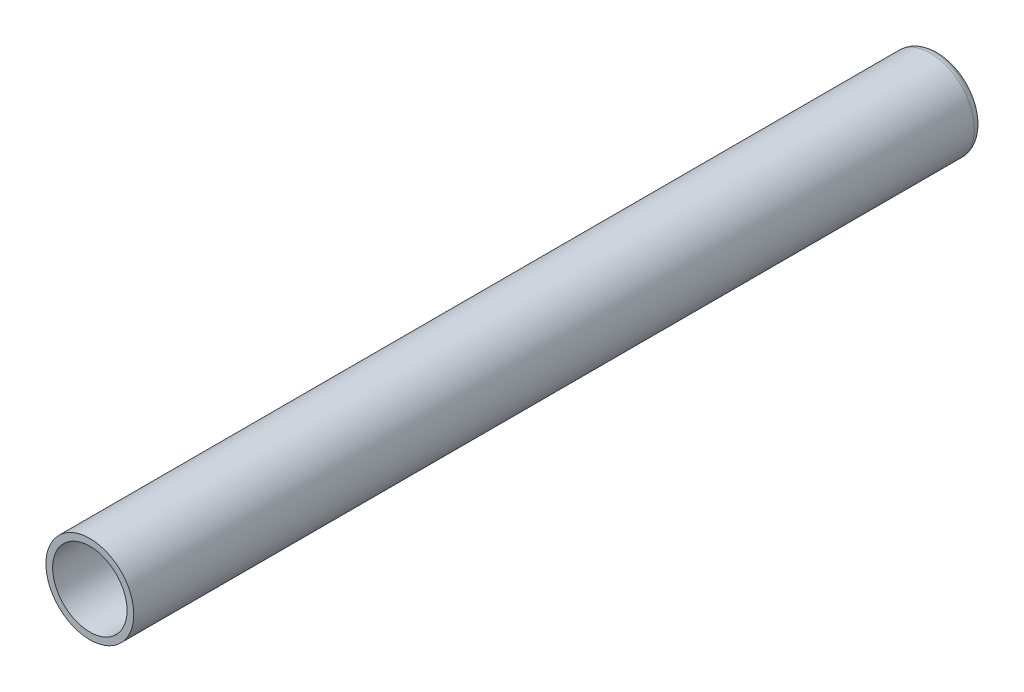
ISO-10303-21;
HEADER;
FILE_DESCRIPTION(('STEP AP214'),'2;1');
FILE_NAME('part.step','',(''),(''),'','','');
FILE_SCHEMA(('AUTOMOTIVE_DESIGN { 1 0 10303 214 1 1 1 1 }'));
ENDSEC;
DATA;
#1=APPLICATION_CONTEXT('core data for automotive mechanical design processes');
#2=APPLICATION_PROTOCOL_DEFINITION('international standard','automotive_design',2000,#1);
#3=PRODUCT_CONTEXT('',#1,'mechanical');
#4=PRODUCT('Part','Part','',(#3));
#5=PRODUCT_RELATED_PRODUCT_CATEGORY('part','',(#4));
#6=PRODUCT_DEFINITION_FORMATION('','',#4);
#7=PRODUCT_DEFINITION_CONTEXT('part definition',#1,'design');
#8=PRODUCT_DEFINITION('design','',#6,#7);
#9=PRODUCT_DEFINITION_SHAPE('','',#8);
#10=(LENGTH_UNIT() NAMED_UNIT(*) SI_UNIT(.MILLI.,.METRE.));
#11=(NAMED_UNIT(*) PLANE_ANGLE_UNIT() SI_UNIT($,.RADIAN.));
#12=(NAMED_UNIT(*) SI_UNIT($,.STERADIAN.) SOLID_ANGLE_UNIT());
#13=UNCERTAINTY_MEASURE_WITH_UNIT(LENGTH_MEASURE(1.E-05),#10,'distance_accuracy_value','');
#14=(GEOMETRIC_REPRESENTATION_CONTEXT(3) GLOBAL_UNCERTAINTY_ASSIGNED_CONTEXT((#13)) GLOBAL_UNIT_ASSIGNED_CONTEXT((#10,
#11,#12)) REPRESENTATION_CONTEXT('',''));
#15=CARTESIAN_POINT('',(0.,0.,0.));
#16=DIRECTION('',(0.,0.,1.));
#17=DIRECTION('',(1.,0.,0.));
#18=AXIS2_PLACEMENT_3D('',#15,#16,#17);
#19=CARTESIAN_POINT('',(0.,0.,-290.));
#20=DIRECTION('',(0.,0.,1.));
#21=DIRECTION('',(1.,0.,0.));
#22=AXIS2_PLACEMENT_3D('',#19,#20,#21);
#23=CYLINDRICAL_SURFACE('',#22,15.);
#24=CARTESIAN_POINT('',(0.,0.,-287.));
#25=DIRECTION('',(0.,0.,1.));
#26=DIRECTION('',(1.,0.,0.));
#27=AXIS2_PLACEMENT_3D('',#24,#25,#26);
#28=CIRCLE('',#27,15.);
#29=CARTESIAN_POINT('',(15.,0.,-287.));
#30=VERTEX_POINT('',#29);
#31=EDGE_CURVE('E42',#30,#30,#28,.T.);
#32=ORIENTED_EDGE('',*,*,#31,.T.);
#33=EDGE_LOOP('',(#32));
#34=FACE_BOUND('',#33,.T.);
#35=CARTESIAN_POINT('',(0.,0.,0.));
#36=DIRECTION('',(0.,0.,1.));
#37=DIRECTION('',(1.,0.,0.));
#38=AXIS2_PLACEMENT_3D('',#35,#36,#37);
#39=CIRCLE('',#38,15.);
#40=CARTESIAN_POINT('',(15.,0.,0.));
#41=VERTEX_POINT('',#40);
#42=EDGE_CURVE('E46',#41,#41,#39,.T.);
#43=ORIENTED_EDGE('',*,*,#42,.F.);
#44=EDGE_LOOP('',(#43));
#45=FACE_BOUND('',#44,.T.);
#46=ADVANCED_FACE('F35',(#34,#45),#23,.T.);
#47=CARTESIAN_POINT('',(0.,0.,-290.));
#48=DIRECTION('',(0.,0.,1.));
#49=DIRECTION('',(1.,0.,0.));
#50=AXIS2_PLACEMENT_3D('',#47,#48,#49);
#51=PLANE('',#50);
#52=CARTESIAN_POINT('',(0.,0.,-290.));
#53=DIRECTION('',(0.,0.,1.));
#54=DIRECTION('',(1.,0.,0.));
#55=AXIS2_PLACEMENT_3D('',#52,#53,#54);
#56=CIRCLE('',#55,12.);
#57=CARTESIAN_POINT('',(12.,0.,-290.));
#58=VERTEX_POINT('',#57);
#59=EDGE_CURVE('E10',#58,#58,#56,.F.);
#60=ORIENTED_EDGE('',*,*,#59,.T.);
#61=EDGE_LOOP('',(#60));
#62=FACE_BOUND('',#61,.T.);
#63=ADVANCED_FACE('F70',(#62),#51,.F.);
#64=CARTESIAN_POINT('',(0.,0.,0.));
#65=DIRECTION('',(0.,0.,1.));
#66=DIRECTION('',(1.,0.,0.));
#67=AXIS2_PLACEMENT_3D('',#64,#65,#66);
#68=PLANE('',#67);
#69=CARTESIAN_POINT('',(0.,0.,0.));
#70=DIRECTION('',(0.,0.,1.));
#71=DIRECTION('',(1.,0.,0.));
#72=AXIS2_PLACEMENT_3D('',#69,#70,#71);
#73=CIRCLE('',#72,12.7);
#74=CARTESIAN_POINT('',(12.7,0.,0.));
#75=VERTEX_POINT('',#74);
#76=EDGE_CURVE('E53',#75,#75,#73,.T.);
#77=ORIENTED_EDGE('',*,*,#76,.F.);
#78=EDGE_LOOP('',(#77));
#79=FACE_BOUND('',#78,.T.);
#80=ORIENTED_EDGE('',*,*,#42,.T.);
#81=EDGE_LOOP('',(#80));
#82=FACE_BOUND('',#81,.T.);
#83=ADVANCED_FACE('F64',(#79,#82),#68,.T.);
#84=CARTESIAN_POINT('',(0.,0.,-282.));
#85=DIRECTION('',(0.,0.,1.));
#86=DIRECTION('',(1.,0.,0.));
#87=AXIS2_PLACEMENT_3D('',#84,#85,#86);
#88=CYLINDRICAL_SURFACE('',#87,12.7);
#89=CARTESIAN_POINT('',(0.,0.,-282.));
#90=DIRECTION('',(0.,0.,1.));
#91=DIRECTION('',(1.,0.,0.));
#92=AXIS2_PLACEMENT_3D('',#89,#90,#91);
#93=CIRCLE('',#92,12.7);
#94=CARTESIAN_POINT('',(12.7,0.,-282.));
#95=VERTEX_POINT('',#94);
#96=EDGE_CURVE('E50',#95,#95,#93,.T.);
#97=ORIENTED_EDGE('',*,*,#96,.F.);
#98=EDGE_LOOP('',(#97));
#99=FACE_BOUND('',#98,.T.);
#100=ORIENTED_EDGE('',*,*,#76,.T.);
#101=EDGE_LOOP('',(#100));
#102=FACE_BOUND('',#101,.T.);
#103=ADVANCED_FACE('F61',(#99,#102),#88,.F.);
#104=CARTESIAN_POINT('',(0.,0.,-282.));
#105=DIRECTION('',(0.,0.,1.));
#106=DIRECTION('',(1.,0.,0.));
#107=AXIS2_PLACEMENT_3D('',#104,#105,#106);
#108=PLANE('',#107);
#109=ORIENTED_EDGE('',*,*,#96,.T.);
#110=EDGE_LOOP('',(#109));
#111=FACE_BOUND('',#110,.T.);
#112=ADVANCED_FACE('F59',(#111),#108,.T.);
#113=CARTESIAN_POINT('',(0.,0.,-287.));
#114=DIRECTION('',(0.,0.,1.));
#115=DIRECTION('',(1.,0.,0.));
#116=AXIS2_PLACEMENT_3D('',#113,#114,#115);
#117=TOROIDAL_SURFACE('',#116,12.,3.);
#118=ORIENTED_EDGE('',*,*,#59,.F.);
#119=EDGE_LOOP('',(#118));
#120=FACE_BOUND('',#119,.T.);
#121=ORIENTED_EDGE('',*,*,#31,.F.);
#122=EDGE_LOOP('',(#121));
#123=FACE_BOUND('',#122,.T.);
#124=ADVANCED_FACE('F37',(#120,#123),#117,.T.);
#125=CLOSED_SHELL('',(#46,#63,#83,#103,#112,#124));
#126=MANIFOLD_SOLID_BREP('B2',#125);
#127=ADVANCED_BREP_SHAPE_REPRESENTATION('',(#18,#126),#14);
#128=SHAPE_DEFINITION_REPRESENTATION(#9,#127);
ENDSEC;
END-ISO-10303-21;
